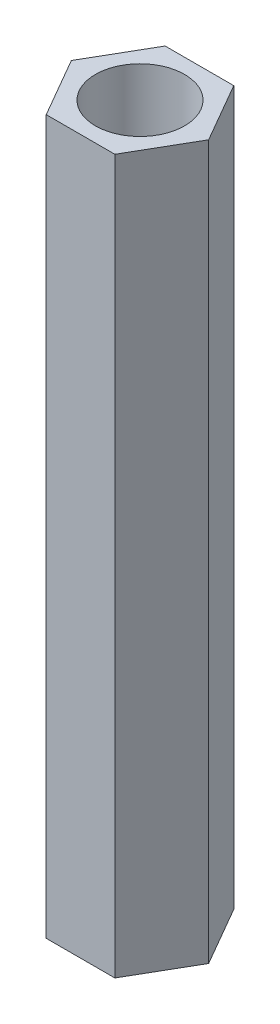
ISO-10303-21;
HEADER;
FILE_DESCRIPTION(('STEP AP214'),'2;1');
FILE_NAME('part.step','',(''),(''),'','','');
FILE_SCHEMA(('AUTOMOTIVE_DESIGN { 1 0 10303 214 1 1 1 1 }'));
ENDSEC;
DATA;
#1=APPLICATION_CONTEXT('core data for automotive mechanical design processes');
#2=APPLICATION_PROTOCOL_DEFINITION('international standard','automotive_design',2000,#1);
#3=PRODUCT_CONTEXT('',#1,'mechanical');
#4=PRODUCT('Part','Part','',(#3));
#5=PRODUCT_RELATED_PRODUCT_CATEGORY('part','',(#4));
#6=PRODUCT_DEFINITION_FORMATION('','',#4);
#7=PRODUCT_DEFINITION_CONTEXT('part definition',#1,'design');
#8=PRODUCT_DEFINITION('design','',#6,#7);
#9=PRODUCT_DEFINITION_SHAPE('','',#8);
#10=(LENGTH_UNIT() NAMED_UNIT(*) SI_UNIT(.MILLI.,.METRE.));
#11=(NAMED_UNIT(*) PLANE_ANGLE_UNIT() SI_UNIT($,.RADIAN.));
#12=(NAMED_UNIT(*) SI_UNIT($,.STERADIAN.) SOLID_ANGLE_UNIT());
#13=UNCERTAINTY_MEASURE_WITH_UNIT(LENGTH_MEASURE(1.E-05),#10,'distance_accuracy_value','');
#14=(GEOMETRIC_REPRESENTATION_CONTEXT(3) GLOBAL_UNCERTAINTY_ASSIGNED_CONTEXT((#13)) GLOBAL_UNIT_ASSIGNED_CONTEXT((#10,
#11,#12)) REPRESENTATION_CONTEXT('',''));
#15=CARTESIAN_POINT('',(0.,0.,0.));
#16=DIRECTION('',(0.,0.,1.));
#17=DIRECTION('',(1.,0.,0.));
#18=AXIS2_PLACEMENT_3D('',#15,#16,#17);
#19=CARTESIAN_POINT('',(0.,36.,0.));
#20=DIRECTION('',(0.,1.,0.));
#21=DIRECTION('',(0.,0.,1.));
#22=AXIS2_PLACEMENT_3D('',#19,#20,#21);
#23=PLANE('',#22);
#24=DIRECTION('',(1.,0.,0.));
#25=VECTOR('',#24,1.);
#26=CARTESIAN_POINT('',(-1.73205080756888,36.,3.));
#27=LINE('',#26,#25);
#28=CARTESIAN_POINT('',(-1.73205080756888,36.,3.));
#29=VERTEX_POINT('',#28);
#30=CARTESIAN_POINT('',(1.73205080756888,36.,3.));
#31=VERTEX_POINT('',#30);
#32=EDGE_CURVE('E129',#29,#31,#27,.T.);
#33=ORIENTED_EDGE('',*,*,#32,.T.);
#34=DIRECTION('',(0.5,0.,-0.866025403784438));
#35=VECTOR('',#34,1.);
#36=CARTESIAN_POINT('',(1.73205080756888,36.,3.));
#37=LINE('',#36,#35);
#38=CARTESIAN_POINT('',(3.46410161513776,36.,0.));
#39=VERTEX_POINT('',#38);
#40=EDGE_CURVE('E87',#31,#39,#37,.T.);
#41=ORIENTED_EDGE('',*,*,#40,.T.);
#42=DIRECTION('',(-0.5,0.,-0.866025403784438));
#43=VECTOR('',#42,1.);
#44=CARTESIAN_POINT('',(3.46410161513776,36.,0.));
#45=LINE('',#44,#43);
#46=CARTESIAN_POINT('',(1.73205080756888,36.,-3.));
#47=VERTEX_POINT('',#46);
#48=EDGE_CURVE('E100',#39,#47,#45,.T.);
#49=ORIENTED_EDGE('',*,*,#48,.T.);
#50=DIRECTION('',(-1.,0.,0.));
#51=VECTOR('',#50,1.);
#52=CARTESIAN_POINT('',(1.73205080756888,36.,-3.));
#53=LINE('',#52,#51);
#54=CARTESIAN_POINT('',(-1.73205080756888,36.,-3.));
#55=VERTEX_POINT('',#54);
#56=EDGE_CURVE('E94',#47,#55,#53,.T.);
#57=ORIENTED_EDGE('',*,*,#56,.T.);
#58=DIRECTION('',(-0.5,0.,0.866025403784439));
#59=VECTOR('',#58,1.);
#60=CARTESIAN_POINT('',(-1.73205080756888,36.,-3.));
#61=LINE('',#60,#59);
#62=CARTESIAN_POINT('',(-3.46410161513776,36.,0.));
#63=VERTEX_POINT('',#62);
#64=EDGE_CURVE('E98',#55,#63,#61,.T.);
#65=ORIENTED_EDGE('',*,*,#64,.T.);
#66=DIRECTION('',(0.5,0.,0.866025403784439));
#67=VECTOR('',#66,1.);
#68=CARTESIAN_POINT('',(-3.46410161513776,36.,0.));
#69=LINE('',#68,#67);
#70=EDGE_CURVE('E50',#63,#29,#69,.T.);
#71=ORIENTED_EDGE('',*,*,#70,.T.);
#72=EDGE_LOOP('',(#33,#41,#49,#57,#65,#71));
#73=FACE_BOUND('',#72,.T.);
#74=CARTESIAN_POINT('',(0.,36.,0.));
#75=DIRECTION('',(0.,1.,0.));
#76=DIRECTION('',(0.,0.,1.));
#77=AXIS2_PLACEMENT_3D('',#74,#75,#76);
#78=CIRCLE('',#77,2.25);
#79=CARTESIAN_POINT('',(0.,36.,2.25));
#80=VERTEX_POINT('',#79);
#81=EDGE_CURVE('E122',#80,#80,#78,.T.);
#82=ORIENTED_EDGE('',*,*,#81,.F.);
#83=EDGE_LOOP('',(#82));
#84=FACE_BOUND('',#83,.T.);
#85=ADVANCED_FACE('F33',(#73,#84),#23,.T.);
#86=CARTESIAN_POINT('',(0.,0.,0.));
#87=DIRECTION('',(0.,1.,0.));
#88=DIRECTION('',(0.,0.,1.));
#89=AXIS2_PLACEMENT_3D('',#86,#87,#88);
#90=PLANE('',#89);
#91=DIRECTION('',(1.,0.,0.));
#92=VECTOR('',#91,1.);
#93=CARTESIAN_POINT('',(-1.73205080756888,0.,3.));
#94=LINE('',#93,#92);
#95=CARTESIAN_POINT('',(-1.73205080756888,0.,3.));
#96=VERTEX_POINT('',#95);
#97=CARTESIAN_POINT('',(1.73205080756888,0.,3.));
#98=VERTEX_POINT('',#97);
#99=EDGE_CURVE('E118',#96,#98,#94,.T.);
#100=ORIENTED_EDGE('',*,*,#99,.F.);
#101=DIRECTION('',(0.5,0.,0.866025403784439));
#102=VECTOR('',#101,1.);
#103=CARTESIAN_POINT('',(-3.46410161513776,0.,0.));
#104=LINE('',#103,#102);
#105=CARTESIAN_POINT('',(-3.46410161513776,0.,0.));
#106=VERTEX_POINT('',#105);
#107=EDGE_CURVE('E79',#106,#96,#104,.T.);
#108=ORIENTED_EDGE('',*,*,#107,.F.);
#109=DIRECTION('',(-0.5,0.,0.866025403784439));
#110=VECTOR('',#109,1.);
#111=CARTESIAN_POINT('',(-1.73205080756888,0.,-3.));
#112=LINE('',#111,#110);
#113=CARTESIAN_POINT('',(-1.73205080756888,0.,-3.));
#114=VERTEX_POINT('',#113);
#115=EDGE_CURVE('E73',#114,#106,#112,.T.);
#116=ORIENTED_EDGE('',*,*,#115,.F.);
#117=DIRECTION('',(-1.,0.,0.));
#118=VECTOR('',#117,1.);
#119=CARTESIAN_POINT('',(1.73205080756888,0.,-3.));
#120=LINE('',#119,#118);
#121=CARTESIAN_POINT('',(1.73205080756888,0.,-3.));
#122=VERTEX_POINT('',#121);
#123=EDGE_CURVE('E108',#122,#114,#120,.T.);
#124=ORIENTED_EDGE('',*,*,#123,.F.);
#125=DIRECTION('',(-0.5,0.,-0.866025403784438));
#126=VECTOR('',#125,1.);
#127=CARTESIAN_POINT('',(3.46410161513776,0.,0.));
#128=LINE('',#127,#126);
#129=CARTESIAN_POINT('',(3.46410161513776,0.,0.));
#130=VERTEX_POINT('',#129);
#131=EDGE_CURVE('E124',#130,#122,#128,.T.);
#132=ORIENTED_EDGE('',*,*,#131,.F.);
#133=DIRECTION('',(0.5,0.,-0.866025403784438));
#134=VECTOR('',#133,1.);
#135=CARTESIAN_POINT('',(1.73205080756888,0.,3.));
#136=LINE('',#135,#134);
#137=EDGE_CURVE('E121',#98,#130,#136,.T.);
#138=ORIENTED_EDGE('',*,*,#137,.F.);
#139=EDGE_LOOP('',(#100,#108,#116,#124,#132,#138));
#140=FACE_BOUND('',#139,.T.);
#141=CARTESIAN_POINT('',(0.,0.,0.));
#142=DIRECTION('',(0.,1.,0.));
#143=DIRECTION('',(0.,0.,1.));
#144=AXIS2_PLACEMENT_3D('',#141,#142,#143);
#145=CIRCLE('',#144,2.25);
#146=CARTESIAN_POINT('',(0.,0.,2.25));
#147=VERTEX_POINT('',#146);
#148=EDGE_CURVE('E222',#147,#147,#145,.T.);
#149=ORIENTED_EDGE('',*,*,#148,.T.);
#150=EDGE_LOOP('',(#149));
#151=FACE_BOUND('',#150,.T.);
#152=ADVANCED_FACE('F138',(#140,#151),#90,.F.);
#153=CARTESIAN_POINT('',(-1.73205080756888,36.,3.));
#154=DIRECTION('',(0.,0.,-1.));
#155=DIRECTION('',(-1.,0.,0.));
#156=AXIS2_PLACEMENT_3D('',#153,#154,#155);
#157=PLANE('',#156);
#158=ORIENTED_EDGE('',*,*,#99,.T.);
#159=DIRECTION('',(0.,-1.,0.));
#160=VECTOR('',#159,1.);
#161=CARTESIAN_POINT('',(1.73205080756888,36.,3.));
#162=LINE('',#161,#160);
#163=EDGE_CURVE('E11',#31,#98,#162,.T.);
#164=ORIENTED_EDGE('',*,*,#163,.F.);
#165=ORIENTED_EDGE('',*,*,#32,.F.);
#166=DIRECTION('',(0.,-1.,0.));
#167=VECTOR('',#166,1.);
#168=CARTESIAN_POINT('',(-1.73205080756888,36.,3.));
#169=LINE('',#168,#167);
#170=EDGE_CURVE('E114',#29,#96,#169,.T.);
#171=ORIENTED_EDGE('',*,*,#170,.T.);
#172=EDGE_LOOP('',(#158,#164,#165,#171));
#173=FACE_BOUND('',#172,.T.);
#174=ADVANCED_FACE('F35',(#173),#157,.F.);
#175=CARTESIAN_POINT('',(1.73205080756888,36.,3.));
#176=DIRECTION('',(-0.866025403784439,0.,-0.5));
#177=DIRECTION('',(-0.5,0.,0.866025403784439));
#178=AXIS2_PLACEMENT_3D('',#175,#176,#177);
#179=PLANE('',#178);
#180=ORIENTED_EDGE('',*,*,#137,.T.);
#181=DIRECTION('',(0.,-1.,0.));
#182=VECTOR('',#181,1.);
#183=CARTESIAN_POINT('',(3.46410161513776,36.,0.));
#184=LINE('',#183,#182);
#185=EDGE_CURVE('E42',#39,#130,#184,.T.);
#186=ORIENTED_EDGE('',*,*,#185,.F.);
#187=ORIENTED_EDGE('',*,*,#40,.F.);
#188=ORIENTED_EDGE('',*,*,#163,.T.);
#189=EDGE_LOOP('',(#180,#186,#187,#188));
#190=FACE_BOUND('',#189,.T.);
#191=ADVANCED_FACE('F163',(#190),#179,.F.);
#192=CARTESIAN_POINT('',(3.46410161513776,36.,0.));
#193=DIRECTION('',(-0.866025403784438,0.,0.5));
#194=DIRECTION('',(0.5,0.,0.866025403784439));
#195=AXIS2_PLACEMENT_3D('',#192,#193,#194);
#196=PLANE('',#195);
#197=ORIENTED_EDGE('',*,*,#131,.T.);
#198=DIRECTION('',(0.,-1.,0.));
#199=VECTOR('',#198,1.);
#200=CARTESIAN_POINT('',(1.73205080756888,36.,-3.));
#201=LINE('',#200,#199);
#202=EDGE_CURVE('E109',#47,#122,#201,.T.);
#203=ORIENTED_EDGE('',*,*,#202,.F.);
#204=ORIENTED_EDGE('',*,*,#48,.F.);
#205=ORIENTED_EDGE('',*,*,#185,.T.);
#206=EDGE_LOOP('',(#197,#203,#204,#205));
#207=FACE_BOUND('',#206,.T.);
#208=ADVANCED_FACE('F135',(#207),#196,.F.);
#209=CARTESIAN_POINT('',(1.73205080756888,36.,-3.));
#210=DIRECTION('',(0.,0.,1.));
#211=DIRECTION('',(1.,0.,0.));
#212=AXIS2_PLACEMENT_3D('',#209,#210,#211);
#213=PLANE('',#212);
#214=ORIENTED_EDGE('',*,*,#123,.T.);
#215=DIRECTION('',(0.,-1.,0.));
#216=VECTOR('',#215,1.);
#217=CARTESIAN_POINT('',(-1.73205080756888,36.,-3.));
#218=LINE('',#217,#216);
#219=EDGE_CURVE('E105',#55,#114,#218,.T.);
#220=ORIENTED_EDGE('',*,*,#219,.F.);
#221=ORIENTED_EDGE('',*,*,#56,.F.);
#222=ORIENTED_EDGE('',*,*,#202,.T.);
#223=EDGE_LOOP('',(#214,#220,#221,#222));
#224=FACE_BOUND('',#223,.T.);
#225=ADVANCED_FACE('F106',(#224),#213,.F.);
#226=CARTESIAN_POINT('',(-1.73205080756888,36.,-3.));
#227=DIRECTION('',(0.866025403784439,0.,0.5));
#228=DIRECTION('',(0.5,0.,-0.866025403784439));
#229=AXIS2_PLACEMENT_3D('',#226,#227,#228);
#230=PLANE('',#229);
#231=ORIENTED_EDGE('',*,*,#115,.T.);
#232=DIRECTION('',(0.,-1.,0.));
#233=VECTOR('',#232,1.);
#234=CARTESIAN_POINT('',(-3.46410161513776,36.,0.));
#235=LINE('',#234,#233);
#236=EDGE_CURVE('E110',#63,#106,#235,.T.);
#237=ORIENTED_EDGE('',*,*,#236,.F.);
#238=ORIENTED_EDGE('',*,*,#64,.F.);
#239=ORIENTED_EDGE('',*,*,#219,.T.);
#240=EDGE_LOOP('',(#231,#237,#238,#239));
#241=FACE_BOUND('',#240,.T.);
#242=ADVANCED_FACE('F112',(#241),#230,.F.);
#243=CARTESIAN_POINT('',(-3.46410161513776,36.,0.));
#244=DIRECTION('',(0.866025403784438,0.,-0.5));
#245=DIRECTION('',(-0.5,0.,-0.866025403784439));
#246=AXIS2_PLACEMENT_3D('',#243,#244,#245);
#247=PLANE('',#246);
#248=ORIENTED_EDGE('',*,*,#107,.T.);
#249=ORIENTED_EDGE('',*,*,#170,.F.);
#250=ORIENTED_EDGE('',*,*,#70,.F.);
#251=ORIENTED_EDGE('',*,*,#236,.T.);
#252=EDGE_LOOP('',(#248,#249,#250,#251));
#253=FACE_BOUND('',#252,.T.);
#254=ADVANCED_FACE('F143',(#253),#247,.F.);
#255=CARTESIAN_POINT('',(0.,36.,0.));
#256=DIRECTION('',(0.,-1.,0.));
#257=DIRECTION('',(0.,0.,-1.));
#258=AXIS2_PLACEMENT_3D('',#255,#256,#257);
#259=CYLINDRICAL_SURFACE('',#258,2.25);
#260=ORIENTED_EDGE('',*,*,#81,.T.);
#261=EDGE_LOOP('',(#260));
#262=FACE_BOUND('',#261,.T.);
#263=ORIENTED_EDGE('',*,*,#148,.F.);
#264=EDGE_LOOP('',(#263));
#265=FACE_BOUND('',#264,.T.);
#266=ADVANCED_FACE('F145',(#262,#265),#259,.F.);
#267=CLOSED_SHELL('',(#85,#152,#174,#191,#208,#225,#242,#254,#266));
#268=MANIFOLD_SOLID_BREP('B2',#267);
#269=ADVANCED_BREP_SHAPE_REPRESENTATION('',(#18,#268),#14);
#270=SHAPE_DEFINITION_REPRESENTATION(#9,#269);
ENDSEC;
END-ISO-10303-21;
